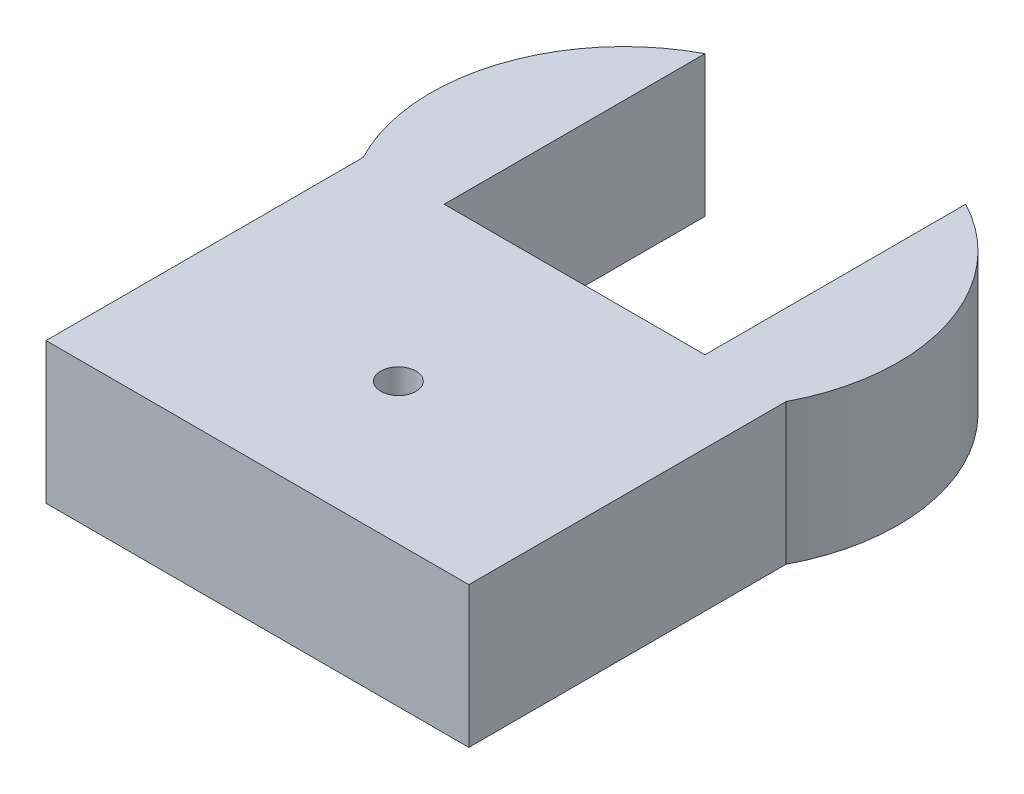
ISO-10303-21;
HEADER;
FILE_DESCRIPTION(('STEP AP214'),'2;1');
FILE_NAME('part.step','',(''),(''),'','','');
FILE_SCHEMA(('AUTOMOTIVE_DESIGN { 1 0 10303 214 1 1 1 1 }'));
ENDSEC;
DATA;
#1=APPLICATION_CONTEXT('core data for automotive mechanical design processes');
#2=APPLICATION_PROTOCOL_DEFINITION('international standard','automotive_design',2000,#1);
#3=PRODUCT_CONTEXT('',#1,'mechanical');
#4=PRODUCT('Part','Part','',(#3));
#5=PRODUCT_RELATED_PRODUCT_CATEGORY('part','',(#4));
#6=PRODUCT_DEFINITION_FORMATION('','',#4);
#7=PRODUCT_DEFINITION_CONTEXT('part definition',#1,'design');
#8=PRODUCT_DEFINITION('design','',#6,#7);
#9=PRODUCT_DEFINITION_SHAPE('','',#8);
#10=(LENGTH_UNIT() NAMED_UNIT(*) SI_UNIT(.MILLI.,.METRE.));
#11=(NAMED_UNIT(*) PLANE_ANGLE_UNIT() SI_UNIT($,.RADIAN.));
#12=(NAMED_UNIT(*) SI_UNIT($,.STERADIAN.) SOLID_ANGLE_UNIT());
#13=UNCERTAINTY_MEASURE_WITH_UNIT(LENGTH_MEASURE(1.E-05),#10,'distance_accuracy_value','');
#14=(GEOMETRIC_REPRESENTATION_CONTEXT(3) GLOBAL_UNCERTAINTY_ASSIGNED_CONTEXT((#13)) GLOBAL_UNIT_ASSIGNED_CONTEXT((#10,
#11,#12)) REPRESENTATION_CONTEXT('',''));
#15=CARTESIAN_POINT('',(0.,0.,0.));
#16=DIRECTION('',(0.,0.,1.));
#17=DIRECTION('',(1.,0.,0.));
#18=AXIS2_PLACEMENT_3D('',#15,#16,#17);
#19=CARTESIAN_POINT('',(-19.8017026169906,20.,0.));
#20=DIRECTION('',(-1.,0.,0.));
#21=DIRECTION('',(0.,0.,1.));
#22=AXIS2_PLACEMENT_3D('',#19,#20,#21);
#23=PLANE('',#22);
#24=DIRECTION('',(0.,0.,-1.));
#25=VECTOR('',#24,1.);
#26=CARTESIAN_POINT('',(-19.8017026169906,0.,0.));
#27=LINE('',#26,#25);
#28=CARTESIAN_POINT('',(-19.8017026169906,0.,0.));
#29=VERTEX_POINT('',#28);
#30=CARTESIAN_POINT('',(-19.8017026169906,0.,-37.));
#31=VERTEX_POINT('',#30);
#32=EDGE_CURVE('E129',#29,#31,#27,.T.);
#33=ORIENTED_EDGE('',*,*,#32,.T.);
#34=DIRECTION('',(0.,-1.,0.));
#35=VECTOR('',#34,1.);
#36=CARTESIAN_POINT('',(-19.8017026169906,20.,-37.));
#37=LINE('',#36,#35);
#38=CARTESIAN_POINT('',(-19.8017026169906,20.,-37.));
#39=VERTEX_POINT('',#38);
#40=EDGE_CURVE('E11',#39,#31,#37,.T.);
#41=ORIENTED_EDGE('',*,*,#40,.F.);
#42=DIRECTION('',(0.,0.,-1.));
#43=VECTOR('',#42,1.);
#44=CARTESIAN_POINT('',(-19.8017026169906,20.,0.));
#45=LINE('',#44,#43);
#46=CARTESIAN_POINT('',(-19.8017026169906,20.,0.));
#47=VERTEX_POINT('',#46);
#48=EDGE_CURVE('E144',#47,#39,#45,.T.);
#49=ORIENTED_EDGE('',*,*,#48,.F.);
#50=DIRECTION('',(0.,-1.,0.));
#51=VECTOR('',#50,1.);
#52=CARTESIAN_POINT('',(-19.8017026169906,20.,0.));
#53=LINE('',#52,#51);
#54=EDGE_CURVE('E125',#47,#29,#53,.T.);
#55=ORIENTED_EDGE('',*,*,#54,.T.);
#56=EDGE_LOOP('',(#33,#41,#49,#55));
#57=FACE_BOUND('',#56,.T.);
#58=ADVANCED_FACE('F33',(#57),#23,.F.);
#59=CARTESIAN_POINT('',(-7.0517026169905,20.,-12.75));
#60=DIRECTION('',(0.,-1.,0.));
#61=DIRECTION('',(0.,0.,-1.));
#62=AXIS2_PLACEMENT_3D('',#59,#60,#61);
#63=CYLINDRICAL_SURFACE('',#62,27.3975363855951);
#64=CARTESIAN_POINT('',(-7.0517026169905,0.,-12.75));
#65=DIRECTION('',(0.,1.,0.));
#66=DIRECTION('',(0.,0.,1.));
#67=AXIS2_PLACEMENT_3D('',#64,#65,#66);
#68=CIRCLE('',#67,27.3975363855951);
#69=CARTESIAN_POINT('',(-31.3017026169906,0.,0.));
#70=VERTEX_POINT('',#69);
#71=EDGE_CURVE('E132',#31,#70,#68,.T.);
#72=ORIENTED_EDGE('',*,*,#71,.T.);
#73=DIRECTION('',(0.,-1.,0.));
#74=VECTOR('',#73,1.);
#75=CARTESIAN_POINT('',(-31.3017026169906,20.,0.));
#76=LINE('',#75,#74);
#77=CARTESIAN_POINT('',(-31.3017026169906,20.,0.));
#78=VERTEX_POINT('',#77);
#79=EDGE_CURVE('E41',#78,#70,#76,.T.);
#80=ORIENTED_EDGE('',*,*,#79,.F.);
#81=CARTESIAN_POINT('',(-7.0517026169905,20.,-12.75));
#82=DIRECTION('',(0.,1.,0.));
#83=DIRECTION('',(0.,0.,1.));
#84=AXIS2_PLACEMENT_3D('',#81,#82,#83);
#85=CIRCLE('',#84,27.3975363855951);
#86=EDGE_CURVE('E92',#39,#78,#85,.T.);
#87=ORIENTED_EDGE('',*,*,#86,.F.);
#88=ORIENTED_EDGE('',*,*,#40,.T.);
#89=EDGE_LOOP('',(#72,#80,#87,#88));
#90=FACE_BOUND('',#89,.T.);
#91=ADVANCED_FACE('F200',(#90),#63,.T.);
#92=CARTESIAN_POINT('',(-31.3017026169906,20.,0.));
#93=DIRECTION('',(1.,0.,0.));
#94=DIRECTION('',(0.,0.,-1.));
#95=AXIS2_PLACEMENT_3D('',#92,#93,#94);
#96=PLANE('',#95);
#97=DIRECTION('',(0.,0.,1.));
#98=VECTOR('',#97,1.);
#99=CARTESIAN_POINT('',(-31.3017026169906,0.,0.));
#100=LINE('',#99,#98);
#101=CARTESIAN_POINT('',(-31.3017026169906,0.,45.));
#102=VERTEX_POINT('',#101);
#103=EDGE_CURVE('E135',#70,#102,#100,.T.);
#104=ORIENTED_EDGE('',*,*,#103,.T.);
#105=DIRECTION('',(0.,-1.,0.));
#106=VECTOR('',#105,1.);
#107=CARTESIAN_POINT('',(-31.3017026169906,20.,45.));
#108=LINE('',#107,#106);
#109=CARTESIAN_POINT('',(-31.3017026169906,20.,45.));
#110=VERTEX_POINT('',#109);
#111=EDGE_CURVE('E151',#110,#102,#108,.T.);
#112=ORIENTED_EDGE('',*,*,#111,.F.);
#113=DIRECTION('',(0.,0.,1.));
#114=VECTOR('',#113,1.);
#115=CARTESIAN_POINT('',(-31.3017026169906,20.,0.));
#116=LINE('',#115,#114);
#117=EDGE_CURVE('E159',#78,#110,#116,.T.);
#118=ORIENTED_EDGE('',*,*,#117,.F.);
#119=ORIENTED_EDGE('',*,*,#79,.T.);
#120=EDGE_LOOP('',(#104,#112,#118,#119));
#121=FACE_BOUND('',#120,.T.);
#122=ADVANCED_FACE('F157',(#121),#96,.F.);
#123=CARTESIAN_POINT('',(-31.3017026169906,20.,45.));
#124=DIRECTION('',(0.,0.,-1.));
#125=DIRECTION('',(-1.,0.,0.));
#126=AXIS2_PLACEMENT_3D('',#123,#124,#125);
#127=PLANE('',#126);
#128=DIRECTION('',(1.,0.,0.));
#129=VECTOR('',#128,1.);
#130=CARTESIAN_POINT('',(-31.3017026169906,0.,45.));
#131=LINE('',#130,#129);
#132=CARTESIAN_POINT('',(28.6982973830094,0.,45.));
#133=VERTEX_POINT('',#132);
#134=EDGE_CURVE('E137',#102,#133,#131,.T.);
#135=ORIENTED_EDGE('',*,*,#134,.T.);
#136=DIRECTION('',(0.,-1.,0.));
#137=VECTOR('',#136,1.);
#138=CARTESIAN_POINT('',(28.6982973830094,20.,45.));
#139=LINE('',#138,#137);
#140=CARTESIAN_POINT('',(28.6982973830094,20.,45.));
#141=VERTEX_POINT('',#140);
#142=EDGE_CURVE('E148',#141,#133,#139,.T.);
#143=ORIENTED_EDGE('',*,*,#142,.F.);
#144=DIRECTION('',(1.,0.,0.));
#145=VECTOR('',#144,1.);
#146=CARTESIAN_POINT('',(-31.3017026169906,20.,45.));
#147=LINE('',#146,#145);
#148=EDGE_CURVE('E171',#110,#141,#147,.T.);
#149=ORIENTED_EDGE('',*,*,#148,.F.);
#150=ORIENTED_EDGE('',*,*,#111,.T.);
#151=EDGE_LOOP('',(#135,#143,#149,#150));
#152=FACE_BOUND('',#151,.T.);
#153=ADVANCED_FACE('F167',(#152),#127,.F.);
#154=CARTESIAN_POINT('',(28.6982973830094,20.,45.));
#155=DIRECTION('',(-1.,0.,0.));
#156=DIRECTION('',(0.,0.,1.));
#157=AXIS2_PLACEMENT_3D('',#154,#155,#156);
#158=PLANE('',#157);
#159=DIRECTION('',(0.,0.,-1.));
#160=VECTOR('',#159,1.);
#161=CARTESIAN_POINT('',(28.6982973830094,0.,45.));
#162=LINE('',#161,#160);
#163=CARTESIAN_POINT('',(28.6982973830094,0.,0.));
#164=VERTEX_POINT('',#163);
#165=EDGE_CURVE('E139',#133,#164,#162,.T.);
#166=ORIENTED_EDGE('',*,*,#165,.T.);
#167=DIRECTION('',(0.,-1.,0.));
#168=VECTOR('',#167,1.);
#169=CARTESIAN_POINT('',(28.6982973830094,20.,0.));
#170=LINE('',#169,#168);
#171=CARTESIAN_POINT('',(28.6982973830094,20.,0.));
#172=VERTEX_POINT('',#171);
#173=EDGE_CURVE('E120',#172,#164,#170,.T.);
#174=ORIENTED_EDGE('',*,*,#173,.F.);
#175=DIRECTION('',(0.,0.,-1.));
#176=VECTOR('',#175,1.);
#177=CARTESIAN_POINT('',(28.6982973830094,20.,45.));
#178=LINE('',#177,#176);
#179=EDGE_CURVE('E111',#141,#172,#178,.T.);
#180=ORIENTED_EDGE('',*,*,#179,.F.);
#181=ORIENTED_EDGE('',*,*,#142,.T.);
#182=EDGE_LOOP('',(#166,#174,#180,#181));
#183=FACE_BOUND('',#182,.T.);
#184=ADVANCED_FACE('F170',(#183),#158,.F.);
#185=CARTESIAN_POINT('',(4.44829738300937,20.,-12.75));
#186=DIRECTION('',(0.,-1.,0.));
#187=DIRECTION('',(0.,0.,-1.));
#188=AXIS2_PLACEMENT_3D('',#185,#186,#187);
#189=CYLINDRICAL_SURFACE('',#188,27.397536385595);
#190=CARTESIAN_POINT('',(4.44829738300937,0.,-12.75));
#191=DIRECTION('',(0.,1.,0.));
#192=DIRECTION('',(0.,0.,-1.));
#193=AXIS2_PLACEMENT_3D('',#190,#191,#192);
#194=CIRCLE('',#193,27.397536385595);
#195=CARTESIAN_POINT('',(17.1982973830094,0.,-37.));
#196=VERTEX_POINT('',#195);
#197=EDGE_CURVE('E119',#164,#196,#194,.T.);
#198=ORIENTED_EDGE('',*,*,#197,.T.);
#199=DIRECTION('',(0.,-1.,0.));
#200=VECTOR('',#199,1.);
#201=CARTESIAN_POINT('',(17.1982973830094,20.,-37.));
#202=LINE('',#201,#200);
#203=CARTESIAN_POINT('',(17.1982973830094,20.,-37.));
#204=VERTEX_POINT('',#203);
#205=EDGE_CURVE('E116',#204,#196,#202,.T.);
#206=ORIENTED_EDGE('',*,*,#205,.F.);
#207=CARTESIAN_POINT('',(4.44829738300937,20.,-12.75));
#208=DIRECTION('',(0.,1.,0.));
#209=DIRECTION('',(0.,0.,-1.));
#210=AXIS2_PLACEMENT_3D('',#207,#208,#209);
#211=CIRCLE('',#210,27.397536385595);
#212=EDGE_CURVE('E105',#172,#204,#211,.T.);
#213=ORIENTED_EDGE('',*,*,#212,.F.);
#214=ORIENTED_EDGE('',*,*,#173,.T.);
#215=EDGE_LOOP('',(#198,#206,#213,#214));
#216=FACE_BOUND('',#215,.T.);
#217=ADVANCED_FACE('F117',(#216),#189,.T.);
#218=CARTESIAN_POINT('',(17.1982973830094,20.,0.));
#219=DIRECTION('',(1.,0.,0.));
#220=DIRECTION('',(0.,0.,-1.));
#221=AXIS2_PLACEMENT_3D('',#218,#219,#220);
#222=PLANE('',#221);
#223=DIRECTION('',(0.,0.,1.));
#224=VECTOR('',#223,1.);
#225=CARTESIAN_POINT('',(17.1982973830094,0.,0.));
#226=LINE('',#225,#224);
#227=CARTESIAN_POINT('',(17.1982973830094,0.,0.));
#228=VERTEX_POINT('',#227);
#229=EDGE_CURVE('E78',#196,#228,#226,.T.);
#230=ORIENTED_EDGE('',*,*,#229,.T.);
#231=DIRECTION('',(0.,-1.,0.));
#232=VECTOR('',#231,1.);
#233=CARTESIAN_POINT('',(17.1982973830094,20.,0.));
#234=LINE('',#233,#232);
#235=CARTESIAN_POINT('',(17.1982973830094,20.,0.));
#236=VERTEX_POINT('',#235);
#237=EDGE_CURVE('E121',#236,#228,#234,.T.);
#238=ORIENTED_EDGE('',*,*,#237,.F.);
#239=DIRECTION('',(0.,0.,1.));
#240=VECTOR('',#239,1.);
#241=CARTESIAN_POINT('',(17.1982973830094,20.,0.));
#242=LINE('',#241,#240);
#243=EDGE_CURVE('E109',#204,#236,#242,.T.);
#244=ORIENTED_EDGE('',*,*,#243,.F.);
#245=ORIENTED_EDGE('',*,*,#205,.T.);
#246=EDGE_LOOP('',(#230,#238,#244,#245));
#247=FACE_BOUND('',#246,.T.);
#248=ADVANCED_FACE('F123',(#247),#222,.F.);
#249=CARTESIAN_POINT('',(-19.8017026169906,20.,0.));
#250=DIRECTION('',(0.,0.,1.));
#251=DIRECTION('',(1.,0.,0.));
#252=AXIS2_PLACEMENT_3D('',#249,#250,#251);
#253=PLANE('',#252);
#254=DIRECTION('',(-1.,0.,0.));
#255=VECTOR('',#254,1.);
#256=CARTESIAN_POINT('',(-19.8017026169906,0.,0.));
#257=LINE('',#256,#255);
#258=EDGE_CURVE('E84',#228,#29,#257,.T.);
#259=ORIENTED_EDGE('',*,*,#258,.T.);
#260=ORIENTED_EDGE('',*,*,#54,.F.);
#261=DIRECTION('',(-1.,0.,0.));
#262=VECTOR('',#261,1.);
#263=CARTESIAN_POINT('',(-19.8017026169906,20.,0.));
#264=LINE('',#263,#262);
#265=EDGE_CURVE('E49',#236,#47,#264,.T.);
#266=ORIENTED_EDGE('',*,*,#265,.F.);
#267=ORIENTED_EDGE('',*,*,#237,.T.);
#268=EDGE_LOOP('',(#259,#260,#266,#267));
#269=FACE_BOUND('',#268,.T.);
#270=ADVANCED_FACE('F191',(#269),#253,.F.);
#271=CARTESIAN_POINT('',(-7.0517026169905,20.,-12.75));
#272=DIRECTION('',(0.,1.,0.));
#273=DIRECTION('',(0.,0.,1.));
#274=AXIS2_PLACEMENT_3D('',#271,#272,#273);
#275=PLANE('',#274);
#276=CARTESIAN_POINT('',(-1.30170261699063,20.,25.));
#277=DIRECTION('',(0.,1.,0.));
#278=DIRECTION('',(0.,0.,1.));
#279=AXIS2_PLACEMENT_3D('',#276,#277,#278);
#280=CIRCLE('',#279,2.5);
#281=CARTESIAN_POINT('',(-1.30170261699063,20.,27.5));
#282=VERTEX_POINT('',#281);
#283=EDGE_CURVE('E177',#282,#282,#280,.T.);
#284=ORIENTED_EDGE('',*,*,#283,.F.);
#285=EDGE_LOOP('',(#284));
#286=FACE_BOUND('',#285,.T.);
#287=ORIENTED_EDGE('',*,*,#48,.T.);
#288=ORIENTED_EDGE('',*,*,#86,.T.);
#289=ORIENTED_EDGE('',*,*,#117,.T.);
#290=ORIENTED_EDGE('',*,*,#148,.T.);
#291=ORIENTED_EDGE('',*,*,#179,.T.);
#292=ORIENTED_EDGE('',*,*,#212,.T.);
#293=ORIENTED_EDGE('',*,*,#243,.T.);
#294=ORIENTED_EDGE('',*,*,#265,.T.);
#295=EDGE_LOOP('',(#287,#288,#289,#290,#291,#292,#293,#294));
#296=FACE_BOUND('',#295,.T.);
#297=ADVANCED_FACE('F107',(#286,#296),#275,.T.);
#298=CARTESIAN_POINT('',(-7.0517026169905,0.,-12.75));
#299=DIRECTION('',(0.,1.,0.));
#300=DIRECTION('',(0.,0.,1.));
#301=AXIS2_PLACEMENT_3D('',#298,#299,#300);
#302=PLANE('',#301);
#303=CARTESIAN_POINT('',(-1.30170261699063,0.,25.));
#304=DIRECTION('',(0.,1.,0.));
#305=DIRECTION('',(0.,0.,1.));
#306=AXIS2_PLACEMENT_3D('',#303,#304,#305);
#307=CIRCLE('',#306,2.5);
#308=CARTESIAN_POINT('',(-1.30170261699063,0.,27.5));
#309=VERTEX_POINT('',#308);
#310=EDGE_CURVE('E133',#309,#309,#307,.T.);
#311=ORIENTED_EDGE('',*,*,#310,.T.);
#312=EDGE_LOOP('',(#311));
#313=FACE_BOUND('',#312,.T.);
#314=ORIENTED_EDGE('',*,*,#32,.F.);
#315=ORIENTED_EDGE('',*,*,#258,.F.);
#316=ORIENTED_EDGE('',*,*,#229,.F.);
#317=ORIENTED_EDGE('',*,*,#197,.F.);
#318=ORIENTED_EDGE('',*,*,#165,.F.);
#319=ORIENTED_EDGE('',*,*,#134,.F.);
#320=ORIENTED_EDGE('',*,*,#103,.F.);
#321=ORIENTED_EDGE('',*,*,#71,.F.);
#322=EDGE_LOOP('',(#314,#315,#316,#317,#318,#319,#320,#321));
#323=FACE_BOUND('',#322,.T.);
#324=ADVANCED_FACE('F163',(#313,#323),#302,.F.);
#325=CARTESIAN_POINT('',(-1.30170261699063,0.,25.));
#326=DIRECTION('',(0.,1.,0.));
#327=DIRECTION('',(0.,0.,1.));
#328=AXIS2_PLACEMENT_3D('',#325,#326,#327);
#329=CYLINDRICAL_SURFACE('',#328,2.5);
#330=ORIENTED_EDGE('',*,*,#310,.F.);
#331=EDGE_LOOP('',(#330));
#332=FACE_BOUND('',#331,.T.);
#333=ORIENTED_EDGE('',*,*,#283,.T.);
#334=EDGE_LOOP('',(#333));
#335=FACE_BOUND('',#334,.T.);
#336=ADVANCED_FACE('F184',(#332,#335),#329,.F.);
#337=CLOSED_SHELL('',(#58,#91,#122,#153,#184,#217,#248,#270,#297,#324,#336));
#338=MANIFOLD_SOLID_BREP('B2',#337);
#339=ADVANCED_BREP_SHAPE_REPRESENTATION('',(#18,#338),#14);
#340=SHAPE_DEFINITION_REPRESENTATION(#9,#339);
ENDSEC;
END-ISO-10303-21;
